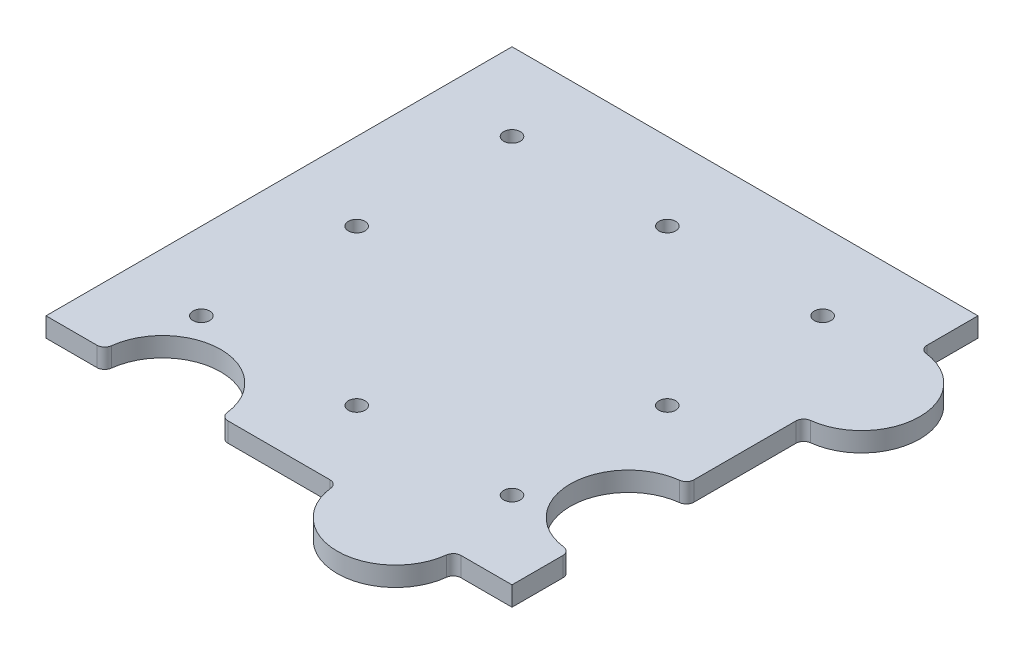
ISO-10303-21;
HEADER;
FILE_DESCRIPTION(('STEP AP214'),'2;1');
FILE_NAME('part.step','',(''),(''),'','','');
FILE_SCHEMA(('AUTOMOTIVE_DESIGN { 1 0 10303 214 1 1 1 1 }'));
ENDSEC;
DATA;
#1=APPLICATION_CONTEXT('core data for automotive mechanical design processes');
#2=APPLICATION_PROTOCOL_DEFINITION('international standard','automotive_design',2000,#1);
#3=PRODUCT_CONTEXT('',#1,'mechanical');
#4=PRODUCT('Part','Part','',(#3));
#5=PRODUCT_RELATED_PRODUCT_CATEGORY('part','',(#4));
#6=PRODUCT_DEFINITION_FORMATION('','',#4);
#7=PRODUCT_DEFINITION_CONTEXT('part definition',#1,'design');
#8=PRODUCT_DEFINITION('design','',#6,#7);
#9=PRODUCT_DEFINITION_SHAPE('','',#8);
#10=(LENGTH_UNIT() NAMED_UNIT(*) SI_UNIT(.MILLI.,.METRE.));
#11=(NAMED_UNIT(*) PLANE_ANGLE_UNIT() SI_UNIT($,.RADIAN.));
#12=(NAMED_UNIT(*) SI_UNIT($,.STERADIAN.) SOLID_ANGLE_UNIT());
#13=UNCERTAINTY_MEASURE_WITH_UNIT(LENGTH_MEASURE(1.E-05),#10,'distance_accuracy_value','');
#14=(GEOMETRIC_REPRESENTATION_CONTEXT(3) GLOBAL_UNCERTAINTY_ASSIGNED_CONTEXT((#13)) GLOBAL_UNIT_ASSIGNED_CONTEXT((#10,
#11,#12)) REPRESENTATION_CONTEXT('',''));
#15=CARTESIAN_POINT('',(0.,0.,0.));
#16=DIRECTION('',(0.,0.,1.));
#17=DIRECTION('',(1.,0.,0.));
#18=AXIS2_PLACEMENT_3D('',#15,#16,#17);
#19=CARTESIAN_POINT('',(60.,5.,30.));
#20=DIRECTION('',(0.,1.,0.));
#21=DIRECTION('',(0.,0.,1.));
#22=AXIS2_PLACEMENT_3D('',#19,#20,#21);
#23=PLANE('',#22);
#24=CARTESIAN_POINT('',(40.,5.,0.));
#25=DIRECTION('',(0.,1.,0.));
#26=DIRECTION('',(0.,0.,1.));
#27=AXIS2_PLACEMENT_3D('',#24,#25,#26);
#28=CIRCLE('',#27,2.15);
#29=CARTESIAN_POINT('',(40.,5.,2.15));
#30=VERTEX_POINT('',#29);
#31=EDGE_CURVE('E478',#30,#30,#28,.T.);
#32=ORIENTED_EDGE('',*,*,#31,.F.);
#33=EDGE_LOOP('',(#32));
#34=FACE_BOUND('',#33,.T.);
#35=CARTESIAN_POINT('',(0.,5.,-40.));
#36=DIRECTION('',(0.,1.,0.));
#37=DIRECTION('',(0.,0.,1.));
#38=AXIS2_PLACEMENT_3D('',#35,#36,#37);
#39=CIRCLE('',#38,2.15);
#40=CARTESIAN_POINT('',(0.,5.,-37.85));
#41=VERTEX_POINT('',#40);
#42=EDGE_CURVE('E462',#41,#41,#39,.T.);
#43=ORIENTED_EDGE('',*,*,#42,.F.);
#44=EDGE_LOOP('',(#43));
#45=FACE_BOUND('',#44,.T.);
#46=CARTESIAN_POINT('',(-40.,5.,40.));
#47=DIRECTION('',(0.,1.,0.));
#48=DIRECTION('',(0.,0.,1.));
#49=AXIS2_PLACEMENT_3D('',#46,#47,#48);
#50=CIRCLE('',#49,2.15);
#51=CARTESIAN_POINT('',(-40.,5.,42.15));
#52=VERTEX_POINT('',#51);
#53=EDGE_CURVE('E446',#52,#52,#50,.T.);
#54=ORIENTED_EDGE('',*,*,#53,.F.);
#55=EDGE_LOOP('',(#54));
#56=FACE_BOUND('',#55,.T.);
#57=CARTESIAN_POINT('',(-40.,5.,-40.));
#58=DIRECTION('',(0.,1.,0.));
#59=DIRECTION('',(0.,0.,1.));
#60=AXIS2_PLACEMENT_3D('',#57,#58,#59);
#61=CIRCLE('',#60,2.15);
#62=CARTESIAN_POINT('',(-40.,5.,-37.85));
#63=VERTEX_POINT('',#62);
#64=EDGE_CURVE('E350',#63,#63,#61,.T.);
#65=ORIENTED_EDGE('',*,*,#64,.F.);
#66=EDGE_LOOP('',(#65));
#67=FACE_BOUND('',#66,.T.);
#68=CARTESIAN_POINT('',(60.,5.,30.));
#69=DIRECTION('',(0.,-1.,0.));
#70=DIRECTION('',(0.,0.,1.));
#71=AXIS2_PLACEMENT_3D('',#68,#69,#70);
#72=CIRCLE('',#71,15.);
#73=CARTESIAN_POINT('',(58.235294117647,5.,44.8958320730595));
#74=VERTEX_POINT('',#73);
#75=CARTESIAN_POINT('',(58.235294117647,5.,15.1041679269405));
#76=VERTEX_POINT('',#75);
#77=EDGE_CURVE('E205',#74,#76,#72,.T.);
#78=ORIENTED_EDGE('',*,*,#77,.T.);
#79=CARTESIAN_POINT('',(58.,5.,13.1180569838659));
#80=DIRECTION('',(0.,1.,0.));
#81=DIRECTION('',(0.,0.,1.));
#82=AXIS2_PLACEMENT_3D('',#79,#80,#81);
#83=CIRCLE('',#82,2.);
#84=CARTESIAN_POINT('',(60.,5.,13.1180569838659));
#85=VERTEX_POINT('',#84);
#86=EDGE_CURVE('E266',#76,#85,#83,.T.);
#87=ORIENTED_EDGE('',*,*,#86,.T.);
#88=DIRECTION('',(0.,0.,-1.));
#89=VECTOR('',#88,1.);
#90=CARTESIAN_POINT('',(60.,5.,-15.));
#91=LINE('',#90,#89);
#92=CARTESIAN_POINT('',(60.,5.,-13.1180569838659));
#93=VERTEX_POINT('',#92);
#94=EDGE_CURVE('E428',#85,#93,#91,.T.);
#95=ORIENTED_EDGE('',*,*,#94,.T.);
#96=CARTESIAN_POINT('',(62.,5.,-13.1180569838659));
#97=DIRECTION('',(0.,1.,0.));
#98=DIRECTION('',(0.,0.,1.));
#99=AXIS2_PLACEMENT_3D('',#96,#97,#98);
#100=CIRCLE('',#99,2.);
#101=CARTESIAN_POINT('',(61.7647058823529,5.,-15.1041679269405));
#102=VERTEX_POINT('',#101);
#103=EDGE_CURVE('E306',#93,#102,#100,.F.);
#104=ORIENTED_EDGE('',*,*,#103,.T.);
#105=CARTESIAN_POINT('',(60.,5.,-30.));
#106=DIRECTION('',(0.,1.,0.));
#107=DIRECTION('',(0.,0.,-1.));
#108=AXIS2_PLACEMENT_3D('',#105,#106,#107);
#109=CIRCLE('',#108,15.);
#110=CARTESIAN_POINT('',(61.7647058823529,5.,-44.8958320730595));
#111=VERTEX_POINT('',#110);
#112=EDGE_CURVE('E424',#102,#111,#109,.T.);
#113=ORIENTED_EDGE('',*,*,#112,.T.);
#114=CARTESIAN_POINT('',(62.,5.,-46.8819430161341));
#115=DIRECTION('',(0.,1.,0.));
#116=DIRECTION('',(0.,0.,1.));
#117=AXIS2_PLACEMENT_3D('',#114,#115,#116);
#118=CIRCLE('',#117,2.);
#119=CARTESIAN_POINT('',(60.,5.,-46.8819430161341));
#120=VERTEX_POINT('',#119);
#121=EDGE_CURVE('E300',#111,#120,#118,.F.);
#122=ORIENTED_EDGE('',*,*,#121,.T.);
#123=DIRECTION('',(0.,0.,-1.));
#124=VECTOR('',#123,1.);
#125=CARTESIAN_POINT('',(60.,5.,-45.));
#126=LINE('',#125,#124);
#127=CARTESIAN_POINT('',(60.,5.,-60.));
#128=VERTEX_POINT('',#127);
#129=EDGE_CURVE('E421',#120,#128,#126,.T.);
#130=ORIENTED_EDGE('',*,*,#129,.T.);
#131=DIRECTION('',(-1.,0.,0.));
#132=VECTOR('',#131,1.);
#133=CARTESIAN_POINT('',(-60.,5.,-60.));
#134=LINE('',#133,#132);
#135=CARTESIAN_POINT('',(-60.,5.,-60.));
#136=VERTEX_POINT('',#135);
#137=EDGE_CURVE('E418',#128,#136,#134,.T.);
#138=ORIENTED_EDGE('',*,*,#137,.T.);
#139=DIRECTION('',(0.,0.,1.));
#140=VECTOR('',#139,1.);
#141=CARTESIAN_POINT('',(-60.,5.,60.));
#142=LINE('',#141,#140);
#143=CARTESIAN_POINT('',(-60.,5.,60.));
#144=VERTEX_POINT('',#143);
#145=EDGE_CURVE('E390',#136,#144,#142,.T.);
#146=ORIENTED_EDGE('',*,*,#145,.T.);
#147=DIRECTION('',(1.,0.,0.));
#148=VECTOR('',#147,1.);
#149=CARTESIAN_POINT('',(-60.,5.,60.));
#150=LINE('',#149,#148);
#151=CARTESIAN_POINT('',(-46.8819430161341,5.,60.));
#152=VERTEX_POINT('',#151);
#153=EDGE_CURVE('E408',#144,#152,#150,.T.);
#154=ORIENTED_EDGE('',*,*,#153,.T.);
#155=CARTESIAN_POINT('',(-46.8819430161341,5.,58.));
#156=DIRECTION('',(0.,1.,0.));
#157=DIRECTION('',(0.,0.,1.));
#158=AXIS2_PLACEMENT_3D('',#155,#156,#157);
#159=CIRCLE('',#158,2.);
#160=CARTESIAN_POINT('',(-44.8958320730595,5.,58.2352941176471));
#161=VERTEX_POINT('',#160);
#162=EDGE_CURVE('E257',#152,#161,#159,.T.);
#163=ORIENTED_EDGE('',*,*,#162,.T.);
#164=CARTESIAN_POINT('',(-30.,5.,60.));
#165=DIRECTION('',(0.,-1.,0.));
#166=DIRECTION('',(0.,0.,-1.));
#167=AXIS2_PLACEMENT_3D('',#164,#165,#166);
#168=CIRCLE('',#167,15.);
#169=CARTESIAN_POINT('',(-15.1041679269405,5.,58.2352941176471));
#170=VERTEX_POINT('',#169);
#171=EDGE_CURVE('E343',#161,#170,#168,.T.);
#172=ORIENTED_EDGE('',*,*,#171,.T.);
#173=CARTESIAN_POINT('',(-13.1180569838659,5.,58.));
#174=DIRECTION('',(0.,1.,0.));
#175=DIRECTION('',(0.,0.,1.));
#176=AXIS2_PLACEMENT_3D('',#173,#174,#175);
#177=CIRCLE('',#176,2.);
#178=CARTESIAN_POINT('',(-13.1180569838659,5.,60.));
#179=VERTEX_POINT('',#178);
#180=EDGE_CURVE('E260',#170,#179,#177,.T.);
#181=ORIENTED_EDGE('',*,*,#180,.T.);
#182=DIRECTION('',(1.,0.,0.));
#183=VECTOR('',#182,1.);
#184=CARTESIAN_POINT('',(-15.,5.,60.));
#185=LINE('',#184,#183);
#186=CARTESIAN_POINT('',(13.1180569838659,5.,60.));
#187=VERTEX_POINT('',#186);
#188=EDGE_CURVE('E337',#179,#187,#185,.T.);
#189=ORIENTED_EDGE('',*,*,#188,.T.);
#190=CARTESIAN_POINT('',(13.1180569838659,5.,62.));
#191=DIRECTION('',(0.,1.,0.));
#192=DIRECTION('',(0.,0.,1.));
#193=AXIS2_PLACEMENT_3D('',#190,#191,#192);
#194=CIRCLE('',#193,2.);
#195=CARTESIAN_POINT('',(15.1041679269405,5.,61.7647058823529));
#196=VERTEX_POINT('',#195);
#197=EDGE_CURVE('E11',#187,#196,#194,.F.);
#198=ORIENTED_EDGE('',*,*,#197,.T.);
#199=CARTESIAN_POINT('',(30.,5.,60.));
#200=DIRECTION('',(0.,1.,0.));
#201=DIRECTION('',(0.,0.,1.));
#202=AXIS2_PLACEMENT_3D('',#199,#200,#201);
#203=CIRCLE('',#202,15.);
#204=CARTESIAN_POINT('',(44.8958320730595,5.,61.7647058823529));
#205=VERTEX_POINT('',#204);
#206=EDGE_CURVE('E334',#196,#205,#203,.T.);
#207=ORIENTED_EDGE('',*,*,#206,.T.);
#208=CARTESIAN_POINT('',(46.8819430161341,5.,62.));
#209=DIRECTION('',(0.,1.,0.));
#210=DIRECTION('',(0.,0.,1.));
#211=AXIS2_PLACEMENT_3D('',#208,#209,#210);
#212=CIRCLE('',#211,2.);
#213=CARTESIAN_POINT('',(46.8819430161341,5.,60.));
#214=VERTEX_POINT('',#213);
#215=EDGE_CURVE('E189',#205,#214,#212,.F.);
#216=ORIENTED_EDGE('',*,*,#215,.T.);
#217=DIRECTION('',(1.,0.,0.));
#218=VECTOR('',#217,1.);
#219=CARTESIAN_POINT('',(45.,5.,60.));
#220=LINE('',#219,#218);
#221=CARTESIAN_POINT('',(60.,5.,60.));
#222=VERTEX_POINT('',#221);
#223=EDGE_CURVE('E182',#214,#222,#220,.T.);
#224=ORIENTED_EDGE('',*,*,#223,.T.);
#225=DIRECTION('',(0.,0.,-1.));
#226=VECTOR('',#225,1.);
#227=CARTESIAN_POINT('',(60.,5.,45.));
#228=LINE('',#227,#226);
#229=CARTESIAN_POINT('',(60.,5.,46.8819430161341));
#230=VERTEX_POINT('',#229);
#231=EDGE_CURVE('E186',#222,#230,#228,.T.);
#232=ORIENTED_EDGE('',*,*,#231,.T.);
#233=CARTESIAN_POINT('',(58.,5.,46.8819430161341));
#234=DIRECTION('',(0.,1.,0.));
#235=DIRECTION('',(0.,0.,1.));
#236=AXIS2_PLACEMENT_3D('',#233,#234,#235);
#237=CIRCLE('',#236,2.);
#238=EDGE_CURVE('E263',#230,#74,#237,.T.);
#239=ORIENTED_EDGE('',*,*,#238,.T.);
#240=EDGE_LOOP('',(#78,#87,#95,#104,#113,#122,#130,#138,#146,#154,#163,#172,#181,#189,#198,#207,
#216,#224,#232,#239));
#241=FACE_BOUND('',#240,.T.);
#242=CARTESIAN_POINT('',(40.,5.,-40.));
#243=DIRECTION('',(0.,1.,0.));
#244=DIRECTION('',(0.,0.,1.));
#245=AXIS2_PLACEMENT_3D('',#242,#243,#244);
#246=CIRCLE('',#245,2.15);
#247=CARTESIAN_POINT('',(40.,5.,-37.85));
#248=VERTEX_POINT('',#247);
#249=EDGE_CURVE('E438',#248,#248,#246,.T.);
#250=ORIENTED_EDGE('',*,*,#249,.F.);
#251=EDGE_LOOP('',(#250));
#252=FACE_BOUND('',#251,.T.);
#253=CARTESIAN_POINT('',(40.,5.,40.));
#254=DIRECTION('',(0.,1.,0.));
#255=DIRECTION('',(0.,0.,1.));
#256=AXIS2_PLACEMENT_3D('',#253,#254,#255);
#257=CIRCLE('',#256,2.15);
#258=CARTESIAN_POINT('',(40.,5.,42.15));
#259=VERTEX_POINT('',#258);
#260=EDGE_CURVE('E454',#259,#259,#257,.T.);
#261=ORIENTED_EDGE('',*,*,#260,.F.);
#262=EDGE_LOOP('',(#261));
#263=FACE_BOUND('',#262,.T.);
#264=CARTESIAN_POINT('',(-40.,5.,0.));
#265=DIRECTION('',(0.,1.,0.));
#266=DIRECTION('',(0.,0.,1.));
#267=AXIS2_PLACEMENT_3D('',#264,#265,#266);
#268=CIRCLE('',#267,2.15);
#269=CARTESIAN_POINT('',(-40.,5.,2.15000000000001));
#270=VERTEX_POINT('',#269);
#271=EDGE_CURVE('E470',#270,#270,#268,.T.);
#272=ORIENTED_EDGE('',*,*,#271,.F.);
#273=EDGE_LOOP('',(#272));
#274=FACE_BOUND('',#273,.T.);
#275=CARTESIAN_POINT('',(0.,5.,40.));
#276=DIRECTION('',(0.,1.,0.));
#277=DIRECTION('',(0.,0.,1.));
#278=AXIS2_PLACEMENT_3D('',#275,#276,#277);
#279=CIRCLE('',#278,2.15);
#280=CARTESIAN_POINT('',(0.,5.,42.15));
#281=VERTEX_POINT('',#280);
#282=EDGE_CURVE('E486',#281,#281,#279,.T.);
#283=ORIENTED_EDGE('',*,*,#282,.F.);
#284=EDGE_LOOP('',(#283));
#285=FACE_BOUND('',#284,.T.);
#286=ADVANCED_FACE('F45',(#34,#45,#56,#67,#241,#252,#263,#274,#285),#23,.T.);
#287=CARTESIAN_POINT('',(60.,0.,30.));
#288=DIRECTION('',(0.,1.,0.));
#289=DIRECTION('',(0.,0.,1.));
#290=AXIS2_PLACEMENT_3D('',#287,#288,#289);
#291=PLANE('',#290);
#292=DIRECTION('',(0.,0.,-1.));
#293=VECTOR('',#292,1.);
#294=CARTESIAN_POINT('',(60.,0.,-15.));
#295=LINE('',#294,#293);
#296=CARTESIAN_POINT('',(60.,0.,13.1180569838659));
#297=VERTEX_POINT('',#296);
#298=CARTESIAN_POINT('',(60.,0.,-13.1180569838659));
#299=VERTEX_POINT('',#298);
#300=EDGE_CURVE('E357',#297,#299,#295,.T.);
#301=ORIENTED_EDGE('',*,*,#300,.F.);
#302=CARTESIAN_POINT('',(58.,0.,13.1180569838659));
#303=DIRECTION('',(0.,1.,0.));
#304=DIRECTION('',(0.,0.,1.));
#305=AXIS2_PLACEMENT_3D('',#302,#303,#304);
#306=CIRCLE('',#305,2.);
#307=CARTESIAN_POINT('',(58.235294117647,0.,15.1041679269405));
#308=VERTEX_POINT('',#307);
#309=EDGE_CURVE('E247',#297,#308,#306,.F.);
#310=ORIENTED_EDGE('',*,*,#309,.T.);
#311=CARTESIAN_POINT('',(60.,0.,30.));
#312=DIRECTION('',(0.,-1.,0.));
#313=DIRECTION('',(0.,0.,1.));
#314=AXIS2_PLACEMENT_3D('',#311,#312,#313);
#315=CIRCLE('',#314,15.);
#316=CARTESIAN_POINT('',(58.235294117647,0.,44.8958320730595));
#317=VERTEX_POINT('',#316);
#318=EDGE_CURVE('E353',#317,#308,#315,.T.);
#319=ORIENTED_EDGE('',*,*,#318,.F.);
#320=CARTESIAN_POINT('',(58.,0.,46.8819430161341));
#321=DIRECTION('',(0.,1.,0.));
#322=DIRECTION('',(0.,0.,1.));
#323=AXIS2_PLACEMENT_3D('',#320,#321,#322);
#324=CIRCLE('',#323,2.);
#325=CARTESIAN_POINT('',(60.,0.,46.8819430161341));
#326=VERTEX_POINT('',#325);
#327=EDGE_CURVE('E244',#317,#326,#324,.F.);
#328=ORIENTED_EDGE('',*,*,#327,.T.);
#329=DIRECTION('',(0.,0.,-1.));
#330=VECTOR('',#329,1.);
#331=CARTESIAN_POINT('',(60.,0.,45.));
#332=LINE('',#331,#330);
#333=CARTESIAN_POINT('',(60.,0.,60.));
#334=VERTEX_POINT('',#333);
#335=EDGE_CURVE('E349',#334,#326,#332,.T.);
#336=ORIENTED_EDGE('',*,*,#335,.F.);
#337=DIRECTION('',(1.,0.,0.));
#338=VECTOR('',#337,1.);
#339=CARTESIAN_POINT('',(45.,0.,60.));
#340=LINE('',#339,#338);
#341=CARTESIAN_POINT('',(46.8819430161341,0.,60.));
#342=VERTEX_POINT('',#341);
#343=EDGE_CURVE('E209',#342,#334,#340,.T.);
#344=ORIENTED_EDGE('',*,*,#343,.F.);
#345=CARTESIAN_POINT('',(46.8819430161341,0.,62.));
#346=DIRECTION('',(0.,1.,0.));
#347=DIRECTION('',(0.,0.,1.));
#348=AXIS2_PLACEMENT_3D('',#345,#346,#347);
#349=CIRCLE('',#348,2.);
#350=CARTESIAN_POINT('',(44.8958320730595,0.,61.7647058823529));
#351=VERTEX_POINT('',#350);
#352=EDGE_CURVE('E309',#342,#351,#349,.T.);
#353=ORIENTED_EDGE('',*,*,#352,.T.);
#354=CARTESIAN_POINT('',(30.,0.,60.));
#355=DIRECTION('',(0.,1.,0.));
#356=DIRECTION('',(0.,0.,1.));
#357=AXIS2_PLACEMENT_3D('',#354,#355,#356);
#358=CIRCLE('',#357,15.);
#359=CARTESIAN_POINT('',(15.1041679269405,0.,61.7647058823529));
#360=VERTEX_POINT('',#359);
#361=EDGE_CURVE('E195',#360,#351,#358,.T.);
#362=ORIENTED_EDGE('',*,*,#361,.F.);
#363=CARTESIAN_POINT('',(13.1180569838659,0.,62.));
#364=DIRECTION('',(0.,1.,0.));
#365=DIRECTION('',(0.,0.,1.));
#366=AXIS2_PLACEMENT_3D('',#363,#364,#365);
#367=CIRCLE('',#366,2.);
#368=CARTESIAN_POINT('',(13.1180569838659,0.,60.));
#369=VERTEX_POINT('',#368);
#370=EDGE_CURVE('E54',#360,#369,#367,.T.);
#371=ORIENTED_EDGE('',*,*,#370,.T.);
#372=DIRECTION('',(1.,0.,0.));
#373=VECTOR('',#372,1.);
#374=CARTESIAN_POINT('',(-15.,0.,60.));
#375=LINE('',#374,#373);
#376=CARTESIAN_POINT('',(-13.1180569838659,0.,60.));
#377=VERTEX_POINT('',#376);
#378=EDGE_CURVE('E321',#377,#369,#375,.T.);
#379=ORIENTED_EDGE('',*,*,#378,.F.);
#380=CARTESIAN_POINT('',(-13.1180569838659,0.,58.));
#381=DIRECTION('',(0.,1.,0.));
#382=DIRECTION('',(0.,0.,1.));
#383=AXIS2_PLACEMENT_3D('',#380,#381,#382);
#384=CIRCLE('',#383,2.);
#385=CARTESIAN_POINT('',(-15.1041679269405,0.,58.2352941176471));
#386=VERTEX_POINT('',#385);
#387=EDGE_CURVE('E241',#377,#386,#384,.F.);
#388=ORIENTED_EDGE('',*,*,#387,.T.);
#389=CARTESIAN_POINT('',(-30.,0.,60.));
#390=DIRECTION('',(0.,-1.,0.));
#391=DIRECTION('',(0.,0.,-1.));
#392=AXIS2_PLACEMENT_3D('',#389,#390,#391);
#393=CIRCLE('',#392,15.);
#394=CARTESIAN_POINT('',(-44.8958320730595,0.,58.2352941176471));
#395=VERTEX_POINT('',#394);
#396=EDGE_CURVE('E330',#395,#386,#393,.T.);
#397=ORIENTED_EDGE('',*,*,#396,.F.);
#398=CARTESIAN_POINT('',(-46.8819430161341,0.,58.));
#399=DIRECTION('',(0.,1.,0.));
#400=DIRECTION('',(0.,0.,1.));
#401=AXIS2_PLACEMENT_3D('',#398,#399,#400);
#402=CIRCLE('',#401,2.);
#403=CARTESIAN_POINT('',(-46.8819430161341,0.,60.));
#404=VERTEX_POINT('',#403);
#405=EDGE_CURVE('E238',#395,#404,#402,.F.);
#406=ORIENTED_EDGE('',*,*,#405,.T.);
#407=DIRECTION('',(1.,0.,0.));
#408=VECTOR('',#407,1.);
#409=CARTESIAN_POINT('',(-60.,0.,60.));
#410=LINE('',#409,#408);
#411=CARTESIAN_POINT('',(-60.,0.,60.));
#412=VERTEX_POINT('',#411);
#413=EDGE_CURVE('E374',#412,#404,#410,.T.);
#414=ORIENTED_EDGE('',*,*,#413,.F.);
#415=DIRECTION('',(0.,0.,1.));
#416=VECTOR('',#415,1.);
#417=CARTESIAN_POINT('',(-60.,0.,60.));
#418=LINE('',#417,#416);
#419=CARTESIAN_POINT('',(-60.,0.,-60.));
#420=VERTEX_POINT('',#419);
#421=EDGE_CURVE('E371',#420,#412,#418,.T.);
#422=ORIENTED_EDGE('',*,*,#421,.F.);
#423=DIRECTION('',(-1.,0.,0.));
#424=VECTOR('',#423,1.);
#425=CARTESIAN_POINT('',(-60.,0.,-60.));
#426=LINE('',#425,#424);
#427=CARTESIAN_POINT('',(60.,0.,-60.));
#428=VERTEX_POINT('',#427);
#429=EDGE_CURVE('E368',#428,#420,#426,.T.);
#430=ORIENTED_EDGE('',*,*,#429,.F.);
#431=DIRECTION('',(0.,0.,-1.));
#432=VECTOR('',#431,1.);
#433=CARTESIAN_POINT('',(60.,0.,-45.));
#434=LINE('',#433,#432);
#435=CARTESIAN_POINT('',(60.,0.,-46.8819430161341));
#436=VERTEX_POINT('',#435);
#437=EDGE_CURVE('E365',#436,#428,#434,.T.);
#438=ORIENTED_EDGE('',*,*,#437,.F.);
#439=CARTESIAN_POINT('',(62.,0.,-46.8819430161341));
#440=DIRECTION('',(0.,1.,0.));
#441=DIRECTION('',(0.,0.,1.));
#442=AXIS2_PLACEMENT_3D('',#439,#440,#441);
#443=CIRCLE('',#442,2.);
#444=CARTESIAN_POINT('',(61.7647058823529,0.,-44.8958320730595));
#445=VERTEX_POINT('',#444);
#446=EDGE_CURVE('E297',#436,#445,#443,.T.);
#447=ORIENTED_EDGE('',*,*,#446,.T.);
#448=CARTESIAN_POINT('',(60.,0.,-30.));
#449=DIRECTION('',(0.,1.,0.));
#450=DIRECTION('',(0.,0.,-1.));
#451=AXIS2_PLACEMENT_3D('',#448,#449,#450);
#452=CIRCLE('',#451,15.);
#453=CARTESIAN_POINT('',(61.7647058823529,0.,-15.1041679269405));
#454=VERTEX_POINT('',#453);
#455=EDGE_CURVE('E361',#454,#445,#452,.T.);
#456=ORIENTED_EDGE('',*,*,#455,.F.);
#457=CARTESIAN_POINT('',(62.,0.,-13.1180569838659));
#458=DIRECTION('',(0.,1.,0.));
#459=DIRECTION('',(0.,0.,1.));
#460=AXIS2_PLACEMENT_3D('',#457,#458,#459);
#461=CIRCLE('',#460,2.);
#462=EDGE_CURVE('E303',#454,#299,#461,.T.);
#463=ORIENTED_EDGE('',*,*,#462,.T.);
#464=EDGE_LOOP('',(#301,#310,#319,#328,#336,#344,#353,#362,#371,#379,#388,#397,#406,#414,#422,
#430,#438,#447,#456,#463));
#465=FACE_BOUND('',#464,.T.);
#466=CARTESIAN_POINT('',(-40.,0.,-40.));
#467=DIRECTION('',(0.,1.,0.));
#468=DIRECTION('',(0.,0.,1.));
#469=AXIS2_PLACEMENT_3D('',#466,#467,#468);
#470=CIRCLE('',#469,2.15);
#471=CARTESIAN_POINT('',(-40.,0.,-37.85));
#472=VERTEX_POINT('',#471);
#473=EDGE_CURVE('E434',#472,#472,#470,.T.);
#474=ORIENTED_EDGE('',*,*,#473,.T.);
#475=EDGE_LOOP('',(#474));
#476=FACE_BOUND('',#475,.T.);
#477=CARTESIAN_POINT('',(40.,0.,-40.));
#478=DIRECTION('',(0.,1.,0.));
#479=DIRECTION('',(0.,0.,1.));
#480=AXIS2_PLACEMENT_3D('',#477,#478,#479);
#481=CIRCLE('',#480,2.15);
#482=CARTESIAN_POINT('',(40.,0.,-37.85));
#483=VERTEX_POINT('',#482);
#484=EDGE_CURVE('E442',#483,#483,#481,.T.);
#485=ORIENTED_EDGE('',*,*,#484,.T.);
#486=EDGE_LOOP('',(#485));
#487=FACE_BOUND('',#486,.T.);
#488=CARTESIAN_POINT('',(-40.,0.,40.));
#489=DIRECTION('',(0.,1.,0.));
#490=DIRECTION('',(0.,0.,1.));
#491=AXIS2_PLACEMENT_3D('',#488,#489,#490);
#492=CIRCLE('',#491,2.15);
#493=CARTESIAN_POINT('',(-40.,0.,42.15));
#494=VERTEX_POINT('',#493);
#495=EDGE_CURVE('E450',#494,#494,#492,.T.);
#496=ORIENTED_EDGE('',*,*,#495,.T.);
#497=EDGE_LOOP('',(#496));
#498=FACE_BOUND('',#497,.T.);
#499=CARTESIAN_POINT('',(40.,0.,40.));
#500=DIRECTION('',(0.,1.,0.));
#501=DIRECTION('',(0.,0.,1.));
#502=AXIS2_PLACEMENT_3D('',#499,#500,#501);
#503=CIRCLE('',#502,2.15);
#504=CARTESIAN_POINT('',(40.,0.,42.15));
#505=VERTEX_POINT('',#504);
#506=EDGE_CURVE('E458',#505,#505,#503,.T.);
#507=ORIENTED_EDGE('',*,*,#506,.T.);
#508=EDGE_LOOP('',(#507));
#509=FACE_BOUND('',#508,.T.);
#510=CARTESIAN_POINT('',(0.,0.,-40.));
#511=DIRECTION('',(0.,1.,0.));
#512=DIRECTION('',(0.,0.,1.));
#513=AXIS2_PLACEMENT_3D('',#510,#511,#512);
#514=CIRCLE('',#513,2.15);
#515=CARTESIAN_POINT('',(0.,0.,-37.85));
#516=VERTEX_POINT('',#515);
#517=EDGE_CURVE('E466',#516,#516,#514,.T.);
#518=ORIENTED_EDGE('',*,*,#517,.T.);
#519=EDGE_LOOP('',(#518));
#520=FACE_BOUND('',#519,.T.);
#521=CARTESIAN_POINT('',(-40.,0.,0.));
#522=DIRECTION('',(0.,1.,0.));
#523=DIRECTION('',(0.,0.,1.));
#524=AXIS2_PLACEMENT_3D('',#521,#522,#523);
#525=CIRCLE('',#524,2.15);
#526=CARTESIAN_POINT('',(-40.,0.,2.15000000000001));
#527=VERTEX_POINT('',#526);
#528=EDGE_CURVE('E474',#527,#527,#525,.T.);
#529=ORIENTED_EDGE('',*,*,#528,.T.);
#530=EDGE_LOOP('',(#529));
#531=FACE_BOUND('',#530,.T.);
#532=CARTESIAN_POINT('',(40.,0.,0.));
#533=DIRECTION('',(0.,1.,0.));
#534=DIRECTION('',(0.,0.,1.));
#535=AXIS2_PLACEMENT_3D('',#532,#533,#534);
#536=CIRCLE('',#535,2.15);
#537=CARTESIAN_POINT('',(40.,0.,2.15));
#538=VERTEX_POINT('',#537);
#539=EDGE_CURVE('E482',#538,#538,#536,.T.);
#540=ORIENTED_EDGE('',*,*,#539,.T.);
#541=EDGE_LOOP('',(#540));
#542=FACE_BOUND('',#541,.T.);
#543=CARTESIAN_POINT('',(0.,0.,40.));
#544=DIRECTION('',(0.,1.,0.));
#545=DIRECTION('',(0.,0.,1.));
#546=AXIS2_PLACEMENT_3D('',#543,#544,#545);
#547=CIRCLE('',#546,2.15);
#548=CARTESIAN_POINT('',(0.,0.,42.15));
#549=VERTEX_POINT('',#548);
#550=EDGE_CURVE('E490',#549,#549,#547,.T.);
#551=ORIENTED_EDGE('',*,*,#550,.T.);
#552=EDGE_LOOP('',(#551));
#553=FACE_BOUND('',#552,.T.);
#554=ADVANCED_FACE('F319',(#465,#476,#487,#498,#509,#520,#531,#542,#553),#291,.F.);
#555=CARTESIAN_POINT('',(45.,5.,60.));
#556=DIRECTION('',(0.,0.,-1.));
#557=DIRECTION('',(-1.,0.,0.));
#558=AXIS2_PLACEMENT_3D('',#555,#556,#557);
#559=PLANE('',#558);
#560=ORIENTED_EDGE('',*,*,#223,.F.);
#561=DIRECTION('',(0.,1.,0.));
#562=VECTOR('',#561,1.);
#563=CARTESIAN_POINT('',(46.8819430161341,0.,60.));
#564=LINE('',#563,#562);
#565=EDGE_CURVE('E271',#214,#342,#564,.F.);
#566=ORIENTED_EDGE('',*,*,#565,.T.);
#567=ORIENTED_EDGE('',*,*,#343,.T.);
#568=DIRECTION('',(0.,-1.,0.));
#569=VECTOR('',#568,1.);
#570=CARTESIAN_POINT('',(60.,5.,60.));
#571=LINE('',#570,#569);
#572=EDGE_CURVE('E201',#222,#334,#571,.T.);
#573=ORIENTED_EDGE('',*,*,#572,.F.);
#574=EDGE_LOOP('',(#560,#566,#567,#573));
#575=FACE_BOUND('',#574,.T.);
#576=ADVANCED_FACE('F207',(#575),#559,.F.);
#577=CARTESIAN_POINT('',(60.,5.,45.));
#578=DIRECTION('',(-1.,0.,0.));
#579=DIRECTION('',(0.,0.,1.));
#580=AXIS2_PLACEMENT_3D('',#577,#578,#579);
#581=PLANE('',#580);
#582=ORIENTED_EDGE('',*,*,#335,.T.);
#583=DIRECTION('',(0.,-1.,0.));
#584=VECTOR('',#583,1.);
#585=CARTESIAN_POINT('',(60.,5.,46.8819430161341));
#586=LINE('',#585,#584);
#587=EDGE_CURVE('E203',#326,#230,#586,.F.);
#588=ORIENTED_EDGE('',*,*,#587,.T.);
#589=ORIENTED_EDGE('',*,*,#231,.F.);
#590=ORIENTED_EDGE('',*,*,#572,.T.);
#591=EDGE_LOOP('',(#582,#588,#589,#590));
#592=FACE_BOUND('',#591,.T.);
#593=ADVANCED_FACE('F200',(#592),#581,.F.);
#594=CARTESIAN_POINT('',(60.,5.,30.));
#595=DIRECTION('',(0.,-1.,0.));
#596=DIRECTION('',(0.,0.,-1.));
#597=AXIS2_PLACEMENT_3D('',#594,#595,#596);
#598=CYLINDRICAL_SURFACE('',#597,15.);
#599=ORIENTED_EDGE('',*,*,#318,.T.);
#600=DIRECTION('',(0.,-1.,0.));
#601=VECTOR('',#600,1.);
#602=CARTESIAN_POINT('',(58.235294117647,5.,15.1041679269405));
#603=LINE('',#602,#601);
#604=EDGE_CURVE('E254',#308,#76,#603,.F.);
#605=ORIENTED_EDGE('',*,*,#604,.T.);
#606=ORIENTED_EDGE('',*,*,#77,.F.);
#607=DIRECTION('',(0.,-1.,0.));
#608=VECTOR('',#607,1.);
#609=CARTESIAN_POINT('',(58.235294117647,5.,44.8958320730595));
#610=LINE('',#609,#608);
#611=EDGE_CURVE('E250',#74,#317,#610,.T.);
#612=ORIENTED_EDGE('',*,*,#611,.T.);
#613=EDGE_LOOP('',(#599,#605,#606,#612));
#614=FACE_BOUND('',#613,.T.);
#615=ADVANCED_FACE('F539',(#614),#598,.F.);
#616=CARTESIAN_POINT('',(60.,5.,-15.));
#617=DIRECTION('',(-1.,0.,0.));
#618=DIRECTION('',(0.,0.,1.));
#619=AXIS2_PLACEMENT_3D('',#616,#617,#618);
#620=PLANE('',#619);
#621=ORIENTED_EDGE('',*,*,#300,.T.);
#622=DIRECTION('',(0.,1.,0.));
#623=VECTOR('',#622,1.);
#624=CARTESIAN_POINT('',(60.,5.,-13.1180569838659));
#625=LINE('',#624,#623);
#626=EDGE_CURVE('E235',#299,#93,#625,.T.);
#627=ORIENTED_EDGE('',*,*,#626,.T.);
#628=ORIENTED_EDGE('',*,*,#94,.F.);
#629=DIRECTION('',(0.,-1.,0.));
#630=VECTOR('',#629,1.);
#631=CARTESIAN_POINT('',(60.,5.,13.1180569838659));
#632=LINE('',#631,#630);
#633=EDGE_CURVE('E231',#85,#297,#632,.T.);
#634=ORIENTED_EDGE('',*,*,#633,.T.);
#635=EDGE_LOOP('',(#621,#627,#628,#634));
#636=FACE_BOUND('',#635,.T.);
#637=ADVANCED_FACE('F535',(#636),#620,.F.);
#638=CARTESIAN_POINT('',(60.,5.,-30.));
#639=DIRECTION('',(0.,-1.,0.));
#640=DIRECTION('',(0.,0.,-1.));
#641=AXIS2_PLACEMENT_3D('',#638,#639,#640);
#642=CYLINDRICAL_SURFACE('',#641,15.);
#643=ORIENTED_EDGE('',*,*,#455,.T.);
#644=DIRECTION('',(0.,-1.,0.));
#645=VECTOR('',#644,1.);
#646=CARTESIAN_POINT('',(61.7647058823529,5.,-44.8958320730595));
#647=LINE('',#646,#645);
#648=EDGE_CURVE('E228',#445,#111,#647,.F.);
#649=ORIENTED_EDGE('',*,*,#648,.T.);
#650=ORIENTED_EDGE('',*,*,#112,.F.);
#651=DIRECTION('',(0.,-1.,0.));
#652=VECTOR('',#651,1.);
#653=CARTESIAN_POINT('',(61.7647058823529,5.,-15.1041679269405));
#654=LINE('',#653,#652);
#655=EDGE_CURVE('E218',#102,#454,#654,.T.);
#656=ORIENTED_EDGE('',*,*,#655,.T.);
#657=EDGE_LOOP('',(#643,#649,#650,#656));
#658=FACE_BOUND('',#657,.T.);
#659=ADVANCED_FACE('F531',(#658),#642,.T.);
#660=CARTESIAN_POINT('',(60.,5.,-45.));
#661=DIRECTION('',(-1.,0.,0.));
#662=DIRECTION('',(0.,0.,1.));
#663=AXIS2_PLACEMENT_3D('',#660,#661,#662);
#664=PLANE('',#663);
#665=ORIENTED_EDGE('',*,*,#129,.F.);
#666=DIRECTION('',(0.,1.,0.));
#667=VECTOR('',#666,1.);
#668=CARTESIAN_POINT('',(60.,0.,-46.8819430161341));
#669=LINE('',#668,#667);
#670=EDGE_CURVE('E212',#120,#436,#669,.F.);
#671=ORIENTED_EDGE('',*,*,#670,.T.);
#672=ORIENTED_EDGE('',*,*,#437,.T.);
#673=DIRECTION('',(0.,-1.,0.));
#674=VECTOR('',#673,1.);
#675=CARTESIAN_POINT('',(60.,5.,-60.));
#676=LINE('',#675,#674);
#677=EDGE_CURVE('E213',#128,#428,#676,.T.);
#678=ORIENTED_EDGE('',*,*,#677,.F.);
#679=EDGE_LOOP('',(#665,#671,#672,#678));
#680=FACE_BOUND('',#679,.T.);
#681=ADVANCED_FACE('F528',(#680),#664,.F.);
#682=CARTESIAN_POINT('',(-60.,5.,-60.));
#683=DIRECTION('',(0.,0.,1.));
#684=DIRECTION('',(1.,0.,0.));
#685=AXIS2_PLACEMENT_3D('',#682,#683,#684);
#686=PLANE('',#685);
#687=ORIENTED_EDGE('',*,*,#429,.T.);
#688=DIRECTION('',(0.,-1.,0.));
#689=VECTOR('',#688,1.);
#690=CARTESIAN_POINT('',(-60.,5.,-60.));
#691=LINE('',#690,#689);
#692=EDGE_CURVE('E221',#136,#420,#691,.T.);
#693=ORIENTED_EDGE('',*,*,#692,.F.);
#694=ORIENTED_EDGE('',*,*,#137,.F.);
#695=ORIENTED_EDGE('',*,*,#677,.T.);
#696=EDGE_LOOP('',(#687,#693,#694,#695));
#697=FACE_BOUND('',#696,.T.);
#698=ADVANCED_FACE('F525',(#697),#686,.F.);
#699=CARTESIAN_POINT('',(-60.,5.,60.));
#700=DIRECTION('',(1.,0.,0.));
#701=DIRECTION('',(0.,0.,-1.));
#702=AXIS2_PLACEMENT_3D('',#699,#700,#701);
#703=PLANE('',#702);
#704=ORIENTED_EDGE('',*,*,#421,.T.);
#705=DIRECTION('',(0.,-1.,0.));
#706=VECTOR('',#705,1.);
#707=CARTESIAN_POINT('',(-60.,5.,60.));
#708=LINE('',#707,#706);
#709=EDGE_CURVE('E336',#144,#412,#708,.T.);
#710=ORIENTED_EDGE('',*,*,#709,.F.);
#711=ORIENTED_EDGE('',*,*,#145,.F.);
#712=ORIENTED_EDGE('',*,*,#692,.T.);
#713=EDGE_LOOP('',(#704,#710,#711,#712));
#714=FACE_BOUND('',#713,.T.);
#715=ADVANCED_FACE('F388',(#714),#703,.F.);
#716=CARTESIAN_POINT('',(-60.,5.,60.));
#717=DIRECTION('',(0.,0.,-1.));
#718=DIRECTION('',(-1.,0.,0.));
#719=AXIS2_PLACEMENT_3D('',#716,#717,#718);
#720=PLANE('',#719);
#721=ORIENTED_EDGE('',*,*,#413,.T.);
#722=DIRECTION('',(0.,-1.,0.));
#723=VECTOR('',#722,1.);
#724=CARTESIAN_POINT('',(-46.8819430161341,5.,60.));
#725=LINE('',#724,#723);
#726=EDGE_CURVE('E294',#404,#152,#725,.F.);
#727=ORIENTED_EDGE('',*,*,#726,.T.);
#728=ORIENTED_EDGE('',*,*,#153,.F.);
#729=ORIENTED_EDGE('',*,*,#709,.T.);
#730=EDGE_LOOP('',(#721,#727,#728,#729));
#731=FACE_BOUND('',#730,.T.);
#732=ADVANCED_FACE('F399',(#731),#720,.F.);
#733=CARTESIAN_POINT('',(-30.,5.,60.));
#734=DIRECTION('',(0.,-1.,0.));
#735=DIRECTION('',(0.,0.,-1.));
#736=AXIS2_PLACEMENT_3D('',#733,#734,#735);
#737=CYLINDRICAL_SURFACE('',#736,15.);
#738=ORIENTED_EDGE('',*,*,#396,.T.);
#739=DIRECTION('',(0.,-1.,0.));
#740=VECTOR('',#739,1.);
#741=CARTESIAN_POINT('',(-15.1041679269405,5.,58.2352941176471));
#742=LINE('',#741,#740);
#743=EDGE_CURVE('E291',#386,#170,#742,.F.);
#744=ORIENTED_EDGE('',*,*,#743,.T.);
#745=ORIENTED_EDGE('',*,*,#171,.F.);
#746=DIRECTION('',(0.,-1.,0.));
#747=VECTOR('',#746,1.);
#748=CARTESIAN_POINT('',(-44.8958320730595,5.,58.2352941176471));
#749=LINE('',#748,#747);
#750=EDGE_CURVE('E287',#161,#395,#749,.T.);
#751=ORIENTED_EDGE('',*,*,#750,.T.);
#752=EDGE_LOOP('',(#738,#744,#745,#751));
#753=FACE_BOUND('',#752,.T.);
#754=ADVANCED_FACE('F410',(#753),#737,.F.);
#755=CARTESIAN_POINT('',(-15.,5.,60.));
#756=DIRECTION('',(0.,0.,-1.));
#757=DIRECTION('',(-1.,0.,0.));
#758=AXIS2_PLACEMENT_3D('',#755,#756,#757);
#759=PLANE('',#758);
#760=ORIENTED_EDGE('',*,*,#378,.T.);
#761=DIRECTION('',(0.,1.,0.));
#762=VECTOR('',#761,1.);
#763=CARTESIAN_POINT('',(13.1180569838659,5.,60.));
#764=LINE('',#763,#762);
#765=EDGE_CURVE('E284',#369,#187,#764,.T.);
#766=ORIENTED_EDGE('',*,*,#765,.T.);
#767=ORIENTED_EDGE('',*,*,#188,.F.);
#768=DIRECTION('',(0.,-1.,0.));
#769=VECTOR('',#768,1.);
#770=CARTESIAN_POINT('',(-13.1180569838659,5.,60.));
#771=LINE('',#770,#769);
#772=EDGE_CURVE('E280',#179,#377,#771,.T.);
#773=ORIENTED_EDGE('',*,*,#772,.T.);
#774=EDGE_LOOP('',(#760,#766,#767,#773));
#775=FACE_BOUND('',#774,.T.);
#776=ADVANCED_FACE('F326',(#775),#759,.F.);
#777=CARTESIAN_POINT('',(30.,5.,60.));
#778=DIRECTION('',(0.,-1.,0.));
#779=DIRECTION('',(0.,0.,-1.));
#780=AXIS2_PLACEMENT_3D('',#777,#778,#779);
#781=CYLINDRICAL_SURFACE('',#780,15.);
#782=ORIENTED_EDGE('',*,*,#361,.T.);
#783=DIRECTION('',(0.,-1.,0.));
#784=VECTOR('',#783,1.);
#785=CARTESIAN_POINT('',(44.8958320730595,5.,61.7647058823529));
#786=LINE('',#785,#784);
#787=EDGE_CURVE('E61',#351,#205,#786,.F.);
#788=ORIENTED_EDGE('',*,*,#787,.T.);
#789=ORIENTED_EDGE('',*,*,#206,.F.);
#790=DIRECTION('',(0.,-1.,0.));
#791=VECTOR('',#790,1.);
#792=CARTESIAN_POINT('',(15.1041679269405,5.,61.7647058823529));
#793=LINE('',#792,#791);
#794=EDGE_CURVE('E274',#196,#360,#793,.T.);
#795=ORIENTED_EDGE('',*,*,#794,.T.);
#796=EDGE_LOOP('',(#782,#788,#789,#795));
#797=FACE_BOUND('',#796,.T.);
#798=ADVANCED_FACE('F333',(#797),#781,.T.);
#799=CARTESIAN_POINT('',(-40.,5.,-40.));
#800=DIRECTION('',(0.,-1.,0.));
#801=DIRECTION('',(0.,0.,-1.));
#802=AXIS2_PLACEMENT_3D('',#799,#800,#801);
#803=CYLINDRICAL_SURFACE('',#802,2.15);
#804=ORIENTED_EDGE('',*,*,#64,.T.);
#805=EDGE_LOOP('',(#804));
#806=FACE_BOUND('',#805,.T.);
#807=ORIENTED_EDGE('',*,*,#473,.F.);
#808=EDGE_LOOP('',(#807));
#809=FACE_BOUND('',#808,.T.);
#810=ADVANCED_FACE('F512',(#806,#809),#803,.F.);
#811=CARTESIAN_POINT('',(40.,5.,-40.));
#812=DIRECTION('',(0.,-1.,0.));
#813=DIRECTION('',(0.,0.,-1.));
#814=AXIS2_PLACEMENT_3D('',#811,#812,#813);
#815=CYLINDRICAL_SURFACE('',#814,2.15);
#816=ORIENTED_EDGE('',*,*,#249,.T.);
#817=EDGE_LOOP('',(#816));
#818=FACE_BOUND('',#817,.T.);
#819=ORIENTED_EDGE('',*,*,#484,.F.);
#820=EDGE_LOOP('',(#819));
#821=FACE_BOUND('',#820,.T.);
#822=ADVANCED_FACE('F675',(#818,#821),#815,.F.);
#823=CARTESIAN_POINT('',(-40.,5.,40.));
#824=DIRECTION('',(0.,-1.,0.));
#825=DIRECTION('',(0.,0.,-1.));
#826=AXIS2_PLACEMENT_3D('',#823,#824,#825);
#827=CYLINDRICAL_SURFACE('',#826,2.15);
#828=ORIENTED_EDGE('',*,*,#53,.T.);
#829=EDGE_LOOP('',(#828));
#830=FACE_BOUND('',#829,.T.);
#831=ORIENTED_EDGE('',*,*,#495,.F.);
#832=EDGE_LOOP('',(#831));
#833=FACE_BOUND('',#832,.T.);
#834=ADVANCED_FACE('F665',(#830,#833),#827,.F.);
#835=CARTESIAN_POINT('',(40.,5.,40.));
#836=DIRECTION('',(0.,-1.,0.));
#837=DIRECTION('',(0.,0.,-1.));
#838=AXIS2_PLACEMENT_3D('',#835,#836,#837);
#839=CYLINDRICAL_SURFACE('',#838,2.15);
#840=ORIENTED_EDGE('',*,*,#260,.T.);
#841=EDGE_LOOP('',(#840));
#842=FACE_BOUND('',#841,.T.);
#843=ORIENTED_EDGE('',*,*,#506,.F.);
#844=EDGE_LOOP('',(#843));
#845=FACE_BOUND('',#844,.T.);
#846=ADVANCED_FACE('F655',(#842,#845),#839,.F.);
#847=CARTESIAN_POINT('',(0.,5.,-40.));
#848=DIRECTION('',(0.,-1.,0.));
#849=DIRECTION('',(0.,0.,-1.));
#850=AXIS2_PLACEMENT_3D('',#847,#848,#849);
#851=CYLINDRICAL_SURFACE('',#850,2.15);
#852=ORIENTED_EDGE('',*,*,#42,.T.);
#853=EDGE_LOOP('',(#852));
#854=FACE_BOUND('',#853,.T.);
#855=ORIENTED_EDGE('',*,*,#517,.F.);
#856=EDGE_LOOP('',(#855));
#857=FACE_BOUND('',#856,.T.);
#858=ADVANCED_FACE('F645',(#854,#857),#851,.F.);
#859=CARTESIAN_POINT('',(-40.,5.,0.));
#860=DIRECTION('',(0.,-1.,0.));
#861=DIRECTION('',(0.,0.,-1.));
#862=AXIS2_PLACEMENT_3D('',#859,#860,#861);
#863=CYLINDRICAL_SURFACE('',#862,2.15);
#864=ORIENTED_EDGE('',*,*,#271,.T.);
#865=EDGE_LOOP('',(#864));
#866=FACE_BOUND('',#865,.T.);
#867=ORIENTED_EDGE('',*,*,#528,.F.);
#868=EDGE_LOOP('',(#867));
#869=FACE_BOUND('',#868,.T.);
#870=ADVANCED_FACE('F635',(#866,#869),#863,.F.);
#871=CARTESIAN_POINT('',(40.,5.,0.));
#872=DIRECTION('',(0.,-1.,0.));
#873=DIRECTION('',(0.,0.,-1.));
#874=AXIS2_PLACEMENT_3D('',#871,#872,#873);
#875=CYLINDRICAL_SURFACE('',#874,2.15);
#876=ORIENTED_EDGE('',*,*,#31,.T.);
#877=EDGE_LOOP('',(#876));
#878=FACE_BOUND('',#877,.T.);
#879=ORIENTED_EDGE('',*,*,#539,.F.);
#880=EDGE_LOOP('',(#879));
#881=FACE_BOUND('',#880,.T.);
#882=ADVANCED_FACE('F626',(#878,#881),#875,.F.);
#883=CARTESIAN_POINT('',(0.,5.,40.));
#884=DIRECTION('',(0.,-1.,0.));
#885=DIRECTION('',(0.,0.,-1.));
#886=AXIS2_PLACEMENT_3D('',#883,#884,#885);
#887=CYLINDRICAL_SURFACE('',#886,2.15);
#888=ORIENTED_EDGE('',*,*,#282,.T.);
#889=EDGE_LOOP('',(#888));
#890=FACE_BOUND('',#889,.T.);
#891=ORIENTED_EDGE('',*,*,#550,.F.);
#892=EDGE_LOOP('',(#891));
#893=FACE_BOUND('',#892,.T.);
#894=ADVANCED_FACE('F498',(#890,#893),#887,.F.);
#895=CARTESIAN_POINT('',(62.,5.,-46.8819430161341));
#896=DIRECTION('',(0.,-1.,0.));
#897=DIRECTION('',(0.,0.,-1.));
#898=AXIS2_PLACEMENT_3D('',#895,#896,#897);
#899=CYLINDRICAL_SURFACE('',#898,2.);
#900=ORIENTED_EDGE('',*,*,#121,.F.);
#901=ORIENTED_EDGE('',*,*,#648,.F.);
#902=ORIENTED_EDGE('',*,*,#446,.F.);
#903=ORIENTED_EDGE('',*,*,#670,.F.);
#904=EDGE_LOOP('',(#900,#901,#902,#903));
#905=FACE_BOUND('',#904,.T.);
#906=ADVANCED_FACE('F548',(#905),#899,.F.);
#907=CARTESIAN_POINT('',(62.,5.,-13.1180569838659));
#908=DIRECTION('',(0.,-1.,0.));
#909=DIRECTION('',(0.,0.,-1.));
#910=AXIS2_PLACEMENT_3D('',#907,#908,#909);
#911=CYLINDRICAL_SURFACE('',#910,2.);
#912=ORIENTED_EDGE('',*,*,#103,.F.);
#913=ORIENTED_EDGE('',*,*,#626,.F.);
#914=ORIENTED_EDGE('',*,*,#462,.F.);
#915=ORIENTED_EDGE('',*,*,#655,.F.);
#916=EDGE_LOOP('',(#912,#913,#914,#915));
#917=FACE_BOUND('',#916,.T.);
#918=ADVANCED_FACE('F551',(#917),#911,.F.);
#919=CARTESIAN_POINT('',(58.,5.,13.1180569838659));
#920=DIRECTION('',(0.,-1.,0.));
#921=DIRECTION('',(0.,0.,-1.));
#922=AXIS2_PLACEMENT_3D('',#919,#920,#921);
#923=CYLINDRICAL_SURFACE('',#922,2.);
#924=ORIENTED_EDGE('',*,*,#86,.F.);
#925=ORIENTED_EDGE('',*,*,#604,.F.);
#926=ORIENTED_EDGE('',*,*,#309,.F.);
#927=ORIENTED_EDGE('',*,*,#633,.F.);
#928=EDGE_LOOP('',(#924,#925,#926,#927));
#929=FACE_BOUND('',#928,.T.);
#930=ADVANCED_FACE('F555',(#929),#923,.T.);
#931=CARTESIAN_POINT('',(58.,5.,46.8819430161341));
#932=DIRECTION('',(0.,-1.,0.));
#933=DIRECTION('',(0.,0.,-1.));
#934=AXIS2_PLACEMENT_3D('',#931,#932,#933);
#935=CYLINDRICAL_SURFACE('',#934,2.);
#936=ORIENTED_EDGE('',*,*,#238,.F.);
#937=ORIENTED_EDGE('',*,*,#587,.F.);
#938=ORIENTED_EDGE('',*,*,#327,.F.);
#939=ORIENTED_EDGE('',*,*,#611,.F.);
#940=EDGE_LOOP('',(#936,#937,#938,#939));
#941=FACE_BOUND('',#940,.T.);
#942=ADVANCED_FACE('F559',(#941),#935,.T.);
#943=CARTESIAN_POINT('',(46.8819430161341,5.,62.));
#944=DIRECTION('',(0.,-1.,0.));
#945=DIRECTION('',(0.,0.,-1.));
#946=AXIS2_PLACEMENT_3D('',#943,#944,#945);
#947=CYLINDRICAL_SURFACE('',#946,2.);
#948=ORIENTED_EDGE('',*,*,#215,.F.);
#949=ORIENTED_EDGE('',*,*,#787,.F.);
#950=ORIENTED_EDGE('',*,*,#352,.F.);
#951=ORIENTED_EDGE('',*,*,#565,.F.);
#952=EDGE_LOOP('',(#948,#949,#950,#951));
#953=FACE_BOUND('',#952,.T.);
#954=ADVANCED_FACE('F563',(#953),#947,.F.);
#955=CARTESIAN_POINT('',(13.1180569838659,5.,62.));
#956=DIRECTION('',(0.,-1.,0.));
#957=DIRECTION('',(0.,0.,-1.));
#958=AXIS2_PLACEMENT_3D('',#955,#956,#957);
#959=CYLINDRICAL_SURFACE('',#958,2.);
#960=ORIENTED_EDGE('',*,*,#197,.F.);
#961=ORIENTED_EDGE('',*,*,#765,.F.);
#962=ORIENTED_EDGE('',*,*,#370,.F.);
#963=ORIENTED_EDGE('',*,*,#794,.F.);
#964=EDGE_LOOP('',(#960,#961,#962,#963));
#965=FACE_BOUND('',#964,.T.);
#966=ADVANCED_FACE('F332',(#965),#959,.F.);
#967=CARTESIAN_POINT('',(-13.1180569838659,5.,58.));
#968=DIRECTION('',(0.,-1.,0.));
#969=DIRECTION('',(0.,0.,-1.));
#970=AXIS2_PLACEMENT_3D('',#967,#968,#969);
#971=CYLINDRICAL_SURFACE('',#970,2.);
#972=ORIENTED_EDGE('',*,*,#180,.F.);
#973=ORIENTED_EDGE('',*,*,#743,.F.);
#974=ORIENTED_EDGE('',*,*,#387,.F.);
#975=ORIENTED_EDGE('',*,*,#772,.F.);
#976=EDGE_LOOP('',(#972,#973,#974,#975));
#977=FACE_BOUND('',#976,.T.);
#978=ADVANCED_FACE('F569',(#977),#971,.T.);
#979=CARTESIAN_POINT('',(-46.8819430161341,5.,58.));
#980=DIRECTION('',(0.,-1.,0.));
#981=DIRECTION('',(0.,0.,-1.));
#982=AXIS2_PLACEMENT_3D('',#979,#980,#981);
#983=CYLINDRICAL_SURFACE('',#982,2.);
#984=ORIENTED_EDGE('',*,*,#162,.F.);
#985=ORIENTED_EDGE('',*,*,#726,.F.);
#986=ORIENTED_EDGE('',*,*,#405,.F.);
#987=ORIENTED_EDGE('',*,*,#750,.F.);
#988=EDGE_LOOP('',(#984,#985,#986,#987));
#989=FACE_BOUND('',#988,.T.);
#990=ADVANCED_FACE('F47',(#989),#983,.T.);
#991=CLOSED_SHELL('',(#286,#554,#576,#593,#615,#637,#659,#681,#698,#715,#732,#754,#776,#798,
#810,#822,#834,#846,#858,#870,#882,#894,#906,#918,#930,#942,#954,#966,#978,#990));
#992=MANIFOLD_SOLID_BREP('B2',#991);
#993=ADVANCED_BREP_SHAPE_REPRESENTATION('',(#18,#992),#14);
#994=SHAPE_DEFINITION_REPRESENTATION(#9,#993);
ENDSEC;
END-ISO-10303-21;
